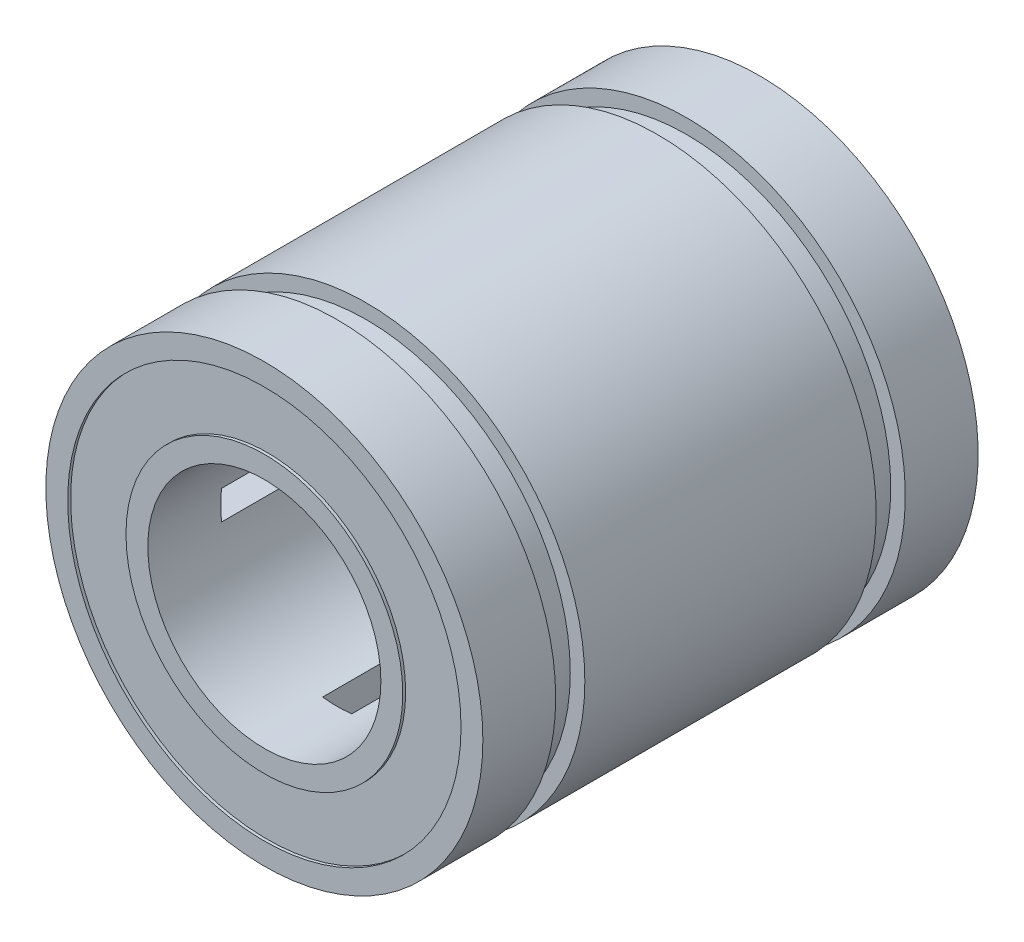
ISO-10303-21;
HEADER;
FILE_DESCRIPTION(('STEP AP214'),'2;1');
FILE_NAME('part.step','',(''),(''),'','','');
FILE_SCHEMA(('AUTOMOTIVE_DESIGN { 1 0 10303 214 1 1 1 1 }'));
ENDSEC;
DATA;
#1=APPLICATION_CONTEXT('core data for automotive mechanical design processes');
#2=APPLICATION_PROTOCOL_DEFINITION('international standard','automotive_design',2000,#1);
#3=PRODUCT_CONTEXT('',#1,'mechanical');
#4=PRODUCT('Part','Part','',(#3));
#5=PRODUCT_RELATED_PRODUCT_CATEGORY('part','',(#4));
#6=PRODUCT_DEFINITION_FORMATION('','',#4);
#7=PRODUCT_DEFINITION_CONTEXT('part definition',#1,'design');
#8=PRODUCT_DEFINITION('design','',#6,#7);
#9=PRODUCT_DEFINITION_SHAPE('','',#8);
#10=(LENGTH_UNIT() NAMED_UNIT(*) SI_UNIT(.MILLI.,.METRE.));
#11=(NAMED_UNIT(*) PLANE_ANGLE_UNIT() SI_UNIT($,.RADIAN.));
#12=(NAMED_UNIT(*) SI_UNIT($,.STERADIAN.) SOLID_ANGLE_UNIT());
#13=UNCERTAINTY_MEASURE_WITH_UNIT(LENGTH_MEASURE(1.E-05),#10,'distance_accuracy_value','');
#14=(GEOMETRIC_REPRESENTATION_CONTEXT(3) GLOBAL_UNCERTAINTY_ASSIGNED_CONTEXT((#13)) GLOBAL_UNIT_ASSIGNED_CONTEXT((#10,
#11,#12)) REPRESENTATION_CONTEXT('',''));
#15=CARTESIAN_POINT('',(0.,0.,0.));
#16=DIRECTION('',(0.,0.,1.));
#17=DIRECTION('',(1.,0.,0.));
#18=AXIS2_PLACEMENT_3D('',#15,#16,#17);
#19=CARTESIAN_POINT('',(0.,0.,-3.5));
#20=DIRECTION('',(0.,0.,-1.));
#21=DIRECTION('',(-1.,0.,0.));
#22=AXIS2_PLACEMENT_3D('',#19,#20,#21);
#23=PLANE('',#22);
#24=CARTESIAN_POINT('',(0.,0.,-3.5));
#25=DIRECTION('',(0.,0.,1.));
#26=DIRECTION('',(1.,0.,0.));
#27=AXIS2_PLACEMENT_3D('',#24,#25,#26);
#28=CIRCLE('',#27,4.);
#29=CARTESIAN_POINT('',(4.,0.,-3.5));
#30=VERTEX_POINT('',#29);
#31=EDGE_CURVE('E289',#30,#30,#28,.T.);
#32=ORIENTED_EDGE('',*,*,#31,.T.);
#33=EDGE_LOOP('',(#32));
#34=FACE_BOUND('',#33,.T.);
#35=CARTESIAN_POINT('',(0.,0.,-3.5));
#36=DIRECTION('',(0.,0.,-1.));
#37=DIRECTION('',(-1.,0.,0.));
#38=AXIS2_PLACEMENT_3D('',#35,#36,#37);
#39=CIRCLE('',#38,4.75);
#40=CARTESIAN_POINT('',(-4.75,0.,-3.5));
#41=VERTEX_POINT('',#40);
#42=EDGE_CURVE('E316',#41,#41,#39,.T.);
#43=ORIENTED_EDGE('',*,*,#42,.T.);
#44=EDGE_LOOP('',(#43));
#45=FACE_BOUND('',#44,.T.);
#46=ADVANCED_FACE('F37',(#34,#45),#23,.T.);
#47=CARTESIAN_POINT('',(0.,0.,13.5));
#48=DIRECTION('',(0.,0.,1.));
#49=DIRECTION('',(1.,0.,0.));
#50=AXIS2_PLACEMENT_3D('',#47,#48,#49);
#51=PLANE('',#50);
#52=CARTESIAN_POINT('',(0.,0.,13.5));
#53=DIRECTION('',(0.,0.,1.));
#54=DIRECTION('',(1.,0.,0.));
#55=AXIS2_PLACEMENT_3D('',#52,#53,#54);
#56=CIRCLE('',#55,4.);
#57=CARTESIAN_POINT('',(4.,0.,13.5));
#58=VERTEX_POINT('',#57);
#59=EDGE_CURVE('E292',#58,#58,#56,.T.);
#60=ORIENTED_EDGE('',*,*,#59,.F.);
#61=EDGE_LOOP('',(#60));
#62=FACE_BOUND('',#61,.T.);
#63=CARTESIAN_POINT('',(0.,0.,13.5));
#64=DIRECTION('',(0.,0.,1.));
#65=DIRECTION('',(1.,0.,0.));
#66=AXIS2_PLACEMENT_3D('',#63,#64,#65);
#67=CIRCLE('',#66,4.75);
#68=CARTESIAN_POINT('',(4.75,0.,13.5));
#69=VERTEX_POINT('',#68);
#70=EDGE_CURVE('E304',#69,#69,#67,.T.);
#71=ORIENTED_EDGE('',*,*,#70,.T.);
#72=EDGE_LOOP('',(#71));
#73=FACE_BOUND('',#72,.T.);
#74=ADVANCED_FACE('F364',(#62,#73),#51,.T.);
#75=CARTESIAN_POINT('',(0.,0.,11.));
#76=DIRECTION('',(0.,0.,1.));
#77=DIRECTION('',(1.,0.,0.));
#78=AXIS2_PLACEMENT_3D('',#75,#76,#77);
#79=PLANE('',#78);
#80=DIRECTION('',(0.,1.,0.));
#81=VECTOR('',#80,1.);
#82=CARTESIAN_POINT('',(0.499999999999999,6.,11.));
#83=LINE('',#82,#81);
#84=CARTESIAN_POINT('',(0.5,3.96862696659689,11.));
#85=VERTEX_POINT('',#84);
#86=CARTESIAN_POINT('',(0.499999999999999,6.,11.));
#87=VERTEX_POINT('',#86);
#88=EDGE_CURVE('E159',#85,#87,#83,.T.);
#89=ORIENTED_EDGE('',*,*,#88,.F.);
#90=CARTESIAN_POINT('',(0.,0.,11.));
#91=DIRECTION('',(0.,0.,1.));
#92=DIRECTION('',(1.,0.,0.));
#93=AXIS2_PLACEMENT_3D('',#90,#91,#92);
#94=CIRCLE('',#93,4.);
#95=CARTESIAN_POINT('',(-0.500000000000001,3.96862696659689,11.));
#96=VERTEX_POINT('',#95);
#97=EDGE_CURVE('E11',#85,#96,#94,.T.);
#98=ORIENTED_EDGE('',*,*,#97,.T.);
#99=DIRECTION('',(0.,-1.,0.));
#100=VECTOR('',#99,1.);
#101=CARTESIAN_POINT('',(-0.500000000000001,6.,11.));
#102=LINE('',#101,#100);
#103=CARTESIAN_POINT('',(-0.500000000000001,6.,11.));
#104=VERTEX_POINT('',#103);
#105=EDGE_CURVE('E228',#104,#96,#102,.T.);
#106=ORIENTED_EDGE('',*,*,#105,.F.);
#107=DIRECTION('',(-1.,0.,0.));
#108=VECTOR('',#107,1.);
#109=CARTESIAN_POINT('',(-0.500000000000001,6.,11.));
#110=LINE('',#109,#108);
#111=EDGE_CURVE('E232',#87,#104,#110,.T.);
#112=ORIENTED_EDGE('',*,*,#111,.F.);
#113=EDGE_LOOP('',(#89,#98,#106,#112));
#114=FACE_BOUND('',#113,.T.);
#115=ADVANCED_FACE('F362',(#114),#79,.F.);
#116=DIRECTION('',(-1.,0.,0.));
#117=VECTOR('',#116,1.);
#118=CARTESIAN_POINT('',(0.,0.5,11.));
#119=LINE('',#118,#117);
#120=CARTESIAN_POINT('',(-3.96862696659689,0.5,11.));
#121=VERTEX_POINT('',#120);
#122=CARTESIAN_POINT('',(-6.,0.5,11.));
#123=VERTEX_POINT('',#122);
#124=EDGE_CURVE('E170',#121,#123,#119,.T.);
#125=ORIENTED_EDGE('',*,*,#124,.F.);
#126=CARTESIAN_POINT('',(-3.96862696659689,-0.5,11.));
#127=VERTEX_POINT('',#126);
#128=EDGE_CURVE('E46',#121,#127,#94,.T.);
#129=ORIENTED_EDGE('',*,*,#128,.T.);
#130=DIRECTION('',(1.,0.,0.));
#131=VECTOR('',#130,1.);
#132=CARTESIAN_POINT('',(-6.,-0.5,11.));
#133=LINE('',#132,#131);
#134=CARTESIAN_POINT('',(-6.,-0.5,11.));
#135=VERTEX_POINT('',#134);
#136=EDGE_CURVE('E265',#135,#127,#133,.T.);
#137=ORIENTED_EDGE('',*,*,#136,.F.);
#138=DIRECTION('',(0.,-1.,0.));
#139=VECTOR('',#138,1.);
#140=CARTESIAN_POINT('',(-6.,0.5,11.));
#141=LINE('',#140,#139);
#142=EDGE_CURVE('E269',#123,#135,#141,.T.);
#143=ORIENTED_EDGE('',*,*,#142,.F.);
#144=EDGE_LOOP('',(#125,#129,#137,#143));
#145=FACE_BOUND('',#144,.T.);
#146=ADVANCED_FACE('F628',(#145),#79,.F.);
#147=CARTESIAN_POINT('',(-0.499999999999999,-3.96862696659689,11.));
#148=VERTEX_POINT('',#147);
#149=CARTESIAN_POINT('',(-0.499999999999999,-6.,11.));
#150=VERTEX_POINT('',#149);
#151=EDGE_CURVE('E231',#148,#150,#102,.T.);
#152=ORIENTED_EDGE('',*,*,#151,.F.);
#153=CARTESIAN_POINT('',(0.5,-3.96862696659689,11.));
#154=VERTEX_POINT('',#153);
#155=EDGE_CURVE('E164',#148,#154,#94,.T.);
#156=ORIENTED_EDGE('',*,*,#155,.T.);
#157=CARTESIAN_POINT('',(0.500000000000001,-6.,11.));
#158=VERTEX_POINT('',#157);
#159=EDGE_CURVE('E235',#158,#154,#83,.T.);
#160=ORIENTED_EDGE('',*,*,#159,.F.);
#161=DIRECTION('',(1.,0.,0.));
#162=VECTOR('',#161,1.);
#163=CARTESIAN_POINT('',(-0.499999999999999,-6.,11.));
#164=LINE('',#163,#162);
#165=EDGE_CURVE('E224',#150,#158,#164,.T.);
#166=ORIENTED_EDGE('',*,*,#165,.F.);
#167=EDGE_LOOP('',(#152,#156,#160,#166));
#168=FACE_BOUND('',#167,.T.);
#169=ADVANCED_FACE('F400',(#168),#79,.F.);
#170=CARTESIAN_POINT('',(0.,0.,0.999999999999999));
#171=DIRECTION('',(0.,0.,1.));
#172=DIRECTION('',(1.,0.,0.));
#173=AXIS2_PLACEMENT_3D('',#170,#171,#172);
#174=PLANE('',#173);
#175=DIRECTION('',(0.,-1.,0.));
#176=VECTOR('',#175,1.);
#177=CARTESIAN_POINT('',(-0.500000000000001,6.,0.999999999999999));
#178=LINE('',#177,#176);
#179=CARTESIAN_POINT('',(-0.499999999999999,-3.96862696659689,0.999999999999999));
#180=VERTEX_POINT('',#179);
#181=CARTESIAN_POINT('',(-0.499999999999999,-6.,0.999999999999999));
#182=VERTEX_POINT('',#181);
#183=EDGE_CURVE('E243',#180,#182,#178,.T.);
#184=ORIENTED_EDGE('',*,*,#183,.T.);
#185=DIRECTION('',(1.,0.,0.));
#186=VECTOR('',#185,1.);
#187=CARTESIAN_POINT('',(-0.499999999999999,-6.,0.999999999999999));
#188=LINE('',#187,#186);
#189=CARTESIAN_POINT('',(0.500000000000001,-6.,0.999999999999999));
#190=VERTEX_POINT('',#189);
#191=EDGE_CURVE('E216',#182,#190,#188,.T.);
#192=ORIENTED_EDGE('',*,*,#191,.T.);
#193=DIRECTION('',(0.,1.,0.));
#194=VECTOR('',#193,1.);
#195=CARTESIAN_POINT('',(0.499999999999999,6.,0.999999999999999));
#196=LINE('',#195,#194);
#197=CARTESIAN_POINT('',(0.5,-3.96862696659689,0.999999999999999));
#198=VERTEX_POINT('',#197);
#199=EDGE_CURVE('E247',#190,#198,#196,.T.);
#200=ORIENTED_EDGE('',*,*,#199,.T.);
#201=CARTESIAN_POINT('',(0.,0.,0.999999999999999));
#202=DIRECTION('',(0.,0.,1.));
#203=DIRECTION('',(1.,0.,0.));
#204=AXIS2_PLACEMENT_3D('',#201,#202,#203);
#205=CIRCLE('',#204,4.);
#206=EDGE_CURVE('E184',#180,#198,#205,.T.);
#207=ORIENTED_EDGE('',*,*,#206,.F.);
#208=EDGE_LOOP('',(#184,#192,#200,#207));
#209=FACE_BOUND('',#208,.T.);
#210=ADVANCED_FACE('F396',(#209),#174,.T.);
#211=CARTESIAN_POINT('',(0.5,3.96862696659689,0.999999999999999));
#212=VERTEX_POINT('',#211);
#213=CARTESIAN_POINT('',(0.499999999999999,6.,0.999999999999999));
#214=VERTEX_POINT('',#213);
#215=EDGE_CURVE('E227',#212,#214,#196,.T.);
#216=ORIENTED_EDGE('',*,*,#215,.T.);
#217=DIRECTION('',(-1.,0.,0.));
#218=VECTOR('',#217,1.);
#219=CARTESIAN_POINT('',(-0.500000000000001,6.,0.999999999999999));
#220=LINE('',#219,#218);
#221=CARTESIAN_POINT('',(-0.500000000000001,6.,0.999999999999999));
#222=VERTEX_POINT('',#221);
#223=EDGE_CURVE('E244',#214,#222,#220,.T.);
#224=ORIENTED_EDGE('',*,*,#223,.T.);
#225=CARTESIAN_POINT('',(-0.500000000000001,3.96862696659689,0.999999999999999));
#226=VERTEX_POINT('',#225);
#227=EDGE_CURVE('E240',#222,#226,#178,.T.);
#228=ORIENTED_EDGE('',*,*,#227,.T.);
#229=EDGE_CURVE('E178',#212,#226,#205,.T.);
#230=ORIENTED_EDGE('',*,*,#229,.F.);
#231=EDGE_LOOP('',(#216,#224,#228,#230));
#232=FACE_BOUND('',#231,.T.);
#233=ADVANCED_FACE('F399',(#232),#174,.T.);
#234=CARTESIAN_POINT('',(0.,0.,0.999999999999999));
#235=DIRECTION('',(0.,0.,1.));
#236=DIRECTION('',(1.,0.,0.));
#237=AXIS2_PLACEMENT_3D('',#234,#235,#236);
#238=PLANE('',#237);
#239=DIRECTION('',(-1.,0.,0.));
#240=VECTOR('',#239,1.);
#241=CARTESIAN_POINT('',(-6.,0.5,0.999999999999999));
#242=LINE('',#241,#240);
#243=CARTESIAN_POINT('',(-3.96862696659689,0.5,0.999999999999999));
#244=VERTEX_POINT('',#243);
#245=CARTESIAN_POINT('',(-6.,0.5,0.999999999999999));
#246=VERTEX_POINT('',#245);
#247=EDGE_CURVE('E283',#244,#246,#242,.T.);
#248=ORIENTED_EDGE('',*,*,#247,.T.);
#249=DIRECTION('',(0.,-1.,0.));
#250=VECTOR('',#249,1.);
#251=CARTESIAN_POINT('',(-6.,0.5,0.999999999999999));
#252=LINE('',#251,#250);
#253=CARTESIAN_POINT('',(-6.,-0.5,0.999999999999999));
#254=VERTEX_POINT('',#253);
#255=EDGE_CURVE('E277',#246,#254,#252,.T.);
#256=ORIENTED_EDGE('',*,*,#255,.T.);
#257=DIRECTION('',(1.,0.,0.));
#258=VECTOR('',#257,1.);
#259=CARTESIAN_POINT('',(-6.,-0.5,0.999999999999999));
#260=LINE('',#259,#258);
#261=CARTESIAN_POINT('',(-3.96862696659689,-0.5,0.999999999999999));
#262=VERTEX_POINT('',#261);
#263=EDGE_CURVE('E258',#254,#262,#260,.T.);
#264=ORIENTED_EDGE('',*,*,#263,.T.);
#265=CARTESIAN_POINT('',(0.,0.,0.999999999999999));
#266=DIRECTION('',(0.,0.,1.));
#267=DIRECTION('',(1.,0.,0.));
#268=AXIS2_PLACEMENT_3D('',#265,#266,#267);
#269=CIRCLE('',#268,4.);
#270=EDGE_CURVE('E165',#244,#262,#269,.T.);
#271=ORIENTED_EDGE('',*,*,#270,.F.);
#272=EDGE_LOOP('',(#248,#256,#264,#271));
#273=FACE_BOUND('',#272,.T.);
#274=ADVANCED_FACE('F419',(#273),#238,.T.);
#275=CARTESIAN_POINT('',(0.,0.,10.));
#276=DIRECTION('',(0.,0.,-1.));
#277=DIRECTION('',(-1.,0.,0.));
#278=AXIS2_PLACEMENT_3D('',#275,#276,#277);
#279=CYLINDRICAL_SURFACE('',#278,4.);
#280=ORIENTED_EDGE('',*,*,#128,.F.);
#281=DIRECTION('',(0.,0.,-1.));
#282=VECTOR('',#281,1.);
#283=CARTESIAN_POINT('',(-3.96862696659689,0.5,10.));
#284=LINE('',#283,#282);
#285=EDGE_CURVE('E251',#244,#121,#284,.F.);
#286=ORIENTED_EDGE('',*,*,#285,.F.);
#287=ORIENTED_EDGE('',*,*,#270,.T.);
#288=DIRECTION('',(0.,0.,-1.));
#289=VECTOR('',#288,1.);
#290=CARTESIAN_POINT('',(-3.96862696659689,-0.5,10.));
#291=LINE('',#290,#289);
#292=EDGE_CURVE('E160',#127,#262,#291,.T.);
#293=ORIENTED_EDGE('',*,*,#292,.F.);
#294=EDGE_LOOP('',(#280,#286,#287,#293));
#295=FACE_BOUND('',#294,.T.);
#296=ORIENTED_EDGE('',*,*,#155,.F.);
#297=DIRECTION('',(0.,0.,-1.));
#298=VECTOR('',#297,1.);
#299=CARTESIAN_POINT('',(-0.499999999999999,-3.96862696659689,10.));
#300=LINE('',#299,#298);
#301=EDGE_CURVE('E182',#180,#148,#300,.F.);
#302=ORIENTED_EDGE('',*,*,#301,.F.);
#303=ORIENTED_EDGE('',*,*,#206,.T.);
#304=DIRECTION('',(0.,0.,-1.));
#305=VECTOR('',#304,1.);
#306=CARTESIAN_POINT('',(0.5,-3.96862696659689,10.));
#307=LINE('',#306,#305);
#308=EDGE_CURVE('E179',#154,#198,#307,.T.);
#309=ORIENTED_EDGE('',*,*,#308,.F.);
#310=EDGE_LOOP('',(#296,#302,#303,#309));
#311=FACE_BOUND('',#310,.T.);
#312=CARTESIAN_POINT('',(3.96862696659689,-0.5,11.));
#313=VERTEX_POINT('',#312);
#314=CARTESIAN_POINT('',(3.96862696659689,0.5,11.));
#315=VERTEX_POINT('',#314);
#316=EDGE_CURVE('E41',#313,#315,#94,.T.);
#317=ORIENTED_EDGE('',*,*,#316,.F.);
#318=DIRECTION('',(0.,0.,-1.));
#319=VECTOR('',#318,1.);
#320=CARTESIAN_POINT('',(3.96862696659689,-0.5,10.));
#321=LINE('',#320,#319);
#322=CARTESIAN_POINT('',(3.96862696659689,-0.5,0.999999999999999));
#323=VERTEX_POINT('',#322);
#324=EDGE_CURVE('E153',#323,#313,#321,.F.);
#325=ORIENTED_EDGE('',*,*,#324,.F.);
#326=CARTESIAN_POINT('',(3.96862696659689,0.5,0.999999999999999));
#327=VERTEX_POINT('',#326);
#328=EDGE_CURVE('E169',#323,#327,#269,.T.);
#329=ORIENTED_EDGE('',*,*,#328,.T.);
#330=DIRECTION('',(0.,0.,-1.));
#331=VECTOR('',#330,1.);
#332=CARTESIAN_POINT('',(3.96862696659689,0.5,10.));
#333=LINE('',#332,#331);
#334=EDGE_CURVE('E53',#315,#327,#333,.T.);
#335=ORIENTED_EDGE('',*,*,#334,.F.);
#336=EDGE_LOOP('',(#317,#325,#329,#335));
#337=FACE_BOUND('',#336,.T.);
#338=DIRECTION('',(0.,0.,-1.));
#339=VECTOR('',#338,1.);
#340=CARTESIAN_POINT('',(-0.500000000000001,3.96862696659689,10.));
#341=LINE('',#340,#339);
#342=EDGE_CURVE('E176',#96,#226,#341,.T.);
#343=ORIENTED_EDGE('',*,*,#342,.F.);
#344=ORIENTED_EDGE('',*,*,#97,.F.);
#345=DIRECTION('',(0.,0.,-1.));
#346=VECTOR('',#345,1.);
#347=CARTESIAN_POINT('',(0.5,3.96862696659689,10.));
#348=LINE('',#347,#346);
#349=EDGE_CURVE('E172',#212,#85,#348,.F.);
#350=ORIENTED_EDGE('',*,*,#349,.F.);
#351=ORIENTED_EDGE('',*,*,#229,.T.);
#352=EDGE_LOOP('',(#343,#344,#350,#351));
#353=FACE_BOUND('',#352,.T.);
#354=ORIENTED_EDGE('',*,*,#59,.T.);
#355=EDGE_LOOP('',(#354));
#356=FACE_BOUND('',#355,.T.);
#357=ORIENTED_EDGE('',*,*,#31,.F.);
#358=EDGE_LOOP('',(#357));
#359=FACE_BOUND('',#358,.T.);
#360=ADVANCED_FACE('F162',(#295,#311,#337,#353,#356,#359),#279,.F.);
#361=CARTESIAN_POINT('',(6.,-0.5,0.999999999999999));
#362=VERTEX_POINT('',#361);
#363=EDGE_CURVE('E158',#323,#362,#260,.T.);
#364=ORIENTED_EDGE('',*,*,#363,.T.);
#365=DIRECTION('',(0.,1.,0.));
#366=VECTOR('',#365,1.);
#367=CARTESIAN_POINT('',(6.,0.5,0.999999999999999));
#368=LINE('',#367,#366);
#369=CARTESIAN_POINT('',(6.,0.5,0.999999999999999));
#370=VERTEX_POINT('',#369);
#371=EDGE_CURVE('E268',#362,#370,#368,.T.);
#372=ORIENTED_EDGE('',*,*,#371,.T.);
#373=EDGE_CURVE('E280',#370,#327,#242,.T.);
#374=ORIENTED_EDGE('',*,*,#373,.T.);
#375=ORIENTED_EDGE('',*,*,#328,.F.);
#376=EDGE_LOOP('',(#364,#372,#374,#375));
#377=FACE_BOUND('',#376,.T.);
#378=ADVANCED_FACE('F394',(#377),#238,.T.);
#379=CARTESIAN_POINT('',(-0.499999999999999,-6.,0.999999999999999));
#380=DIRECTION('',(0.,-1.,0.));
#381=DIRECTION('',(0.,0.,-1.));
#382=AXIS2_PLACEMENT_3D('',#379,#380,#381);
#383=PLANE('',#382);
#384=ORIENTED_EDGE('',*,*,#165,.T.);
#385=DIRECTION('',(0.,0.,1.));
#386=VECTOR('',#385,1.);
#387=CARTESIAN_POINT('',(0.500000000000001,-6.,0.999999999999999));
#388=LINE('',#387,#386);
#389=EDGE_CURVE('E209',#190,#158,#388,.T.);
#390=ORIENTED_EDGE('',*,*,#389,.F.);
#391=ORIENTED_EDGE('',*,*,#191,.F.);
#392=DIRECTION('',(0.,0.,1.));
#393=VECTOR('',#392,1.);
#394=CARTESIAN_POINT('',(-0.499999999999999,-6.,0.999999999999999));
#395=LINE('',#394,#393);
#396=EDGE_CURVE('E219',#182,#150,#395,.T.);
#397=ORIENTED_EDGE('',*,*,#396,.T.);
#398=EDGE_LOOP('',(#384,#390,#391,#397));
#399=FACE_BOUND('',#398,.T.);
#400=ADVANCED_FACE('F384',(#399),#383,.F.);
#401=CARTESIAN_POINT('',(-0.500000000000001,6.,0.999999999999999));
#402=DIRECTION('',(0.,1.,0.));
#403=DIRECTION('',(0.,0.,1.));
#404=AXIS2_PLACEMENT_3D('',#401,#402,#403);
#405=PLANE('',#404);
#406=ORIENTED_EDGE('',*,*,#111,.T.);
#407=DIRECTION('',(0.,0.,1.));
#408=VECTOR('',#407,1.);
#409=CARTESIAN_POINT('',(-0.500000000000001,6.,0.999999999999999));
#410=LINE('',#409,#408);
#411=EDGE_CURVE('E215',#222,#104,#410,.T.);
#412=ORIENTED_EDGE('',*,*,#411,.F.);
#413=ORIENTED_EDGE('',*,*,#223,.F.);
#414=DIRECTION('',(0.,0.,1.));
#415=VECTOR('',#414,1.);
#416=CARTESIAN_POINT('',(0.499999999999999,6.,0.999999999999999));
#417=LINE('',#416,#415);
#418=EDGE_CURVE('E212',#214,#87,#417,.T.);
#419=ORIENTED_EDGE('',*,*,#418,.T.);
#420=EDGE_LOOP('',(#406,#412,#413,#419));
#421=FACE_BOUND('',#420,.T.);
#422=ADVANCED_FACE('F380',(#421),#405,.F.);
#423=CARTESIAN_POINT('',(-6.,-0.5,0.999999999999999));
#424=DIRECTION('',(0.,-1.,0.));
#425=DIRECTION('',(0.,0.,-1.));
#426=AXIS2_PLACEMENT_3D('',#423,#424,#425);
#427=PLANE('',#426);
#428=ORIENTED_EDGE('',*,*,#136,.T.);
#429=ORIENTED_EDGE('',*,*,#292,.T.);
#430=ORIENTED_EDGE('',*,*,#263,.F.);
#431=DIRECTION('',(0.,0.,1.));
#432=VECTOR('',#431,1.);
#433=CARTESIAN_POINT('',(-6.,-0.5,0.999999999999999));
#434=LINE('',#433,#432);
#435=EDGE_CURVE('E261',#254,#135,#434,.T.);
#436=ORIENTED_EDGE('',*,*,#435,.T.);
#437=EDGE_LOOP('',(#428,#429,#430,#436));
#438=FACE_BOUND('',#437,.T.);
#439=ADVANCED_FACE('F383',(#438),#427,.F.);
#440=CARTESIAN_POINT('',(-6.,0.5,0.999999999999999));
#441=DIRECTION('',(-1.,0.,0.));
#442=DIRECTION('',(0.,0.,1.));
#443=AXIS2_PLACEMENT_3D('',#440,#441,#442);
#444=PLANE('',#443);
#445=ORIENTED_EDGE('',*,*,#142,.T.);
#446=ORIENTED_EDGE('',*,*,#435,.F.);
#447=ORIENTED_EDGE('',*,*,#255,.F.);
#448=DIRECTION('',(0.,0.,1.));
#449=VECTOR('',#448,1.);
#450=CARTESIAN_POINT('',(-6.,0.5,0.999999999999999));
#451=LINE('',#450,#449);
#452=EDGE_CURVE('E257',#246,#123,#451,.T.);
#453=ORIENTED_EDGE('',*,*,#452,.T.);
#454=EDGE_LOOP('',(#445,#446,#447,#453));
#455=FACE_BOUND('',#454,.T.);
#456=ADVANCED_FACE('F408',(#455),#444,.F.);
#457=CARTESIAN_POINT('',(-6.,0.5,0.999999999999999));
#458=DIRECTION('',(0.,1.,0.));
#459=DIRECTION('',(0.,0.,1.));
#460=AXIS2_PLACEMENT_3D('',#457,#458,#459);
#461=PLANE('',#460);
#462=ORIENTED_EDGE('',*,*,#285,.T.);
#463=ORIENTED_EDGE('',*,*,#124,.T.);
#464=ORIENTED_EDGE('',*,*,#452,.F.);
#465=ORIENTED_EDGE('',*,*,#247,.F.);
#466=EDGE_LOOP('',(#462,#463,#464,#465));
#467=FACE_BOUND('',#466,.T.);
#468=ADVANCED_FACE('F390',(#467),#461,.F.);
#469=CARTESIAN_POINT('',(-0.500000000000001,6.,0.999999999999999));
#470=DIRECTION('',(-1.,0.,0.));
#471=DIRECTION('',(0.,-1.,0.));
#472=AXIS2_PLACEMENT_3D('',#469,#470,#471);
#473=PLANE('',#472);
#474=ORIENTED_EDGE('',*,*,#105,.T.);
#475=ORIENTED_EDGE('',*,*,#342,.T.);
#476=ORIENTED_EDGE('',*,*,#227,.F.);
#477=ORIENTED_EDGE('',*,*,#411,.T.);
#478=EDGE_LOOP('',(#474,#475,#476,#477));
#479=FACE_BOUND('',#478,.T.);
#480=ADVANCED_FACE('F386',(#479),#473,.F.);
#481=CARTESIAN_POINT('',(6.,0.5,0.999999999999999));
#482=DIRECTION('',(1.,0.,0.));
#483=DIRECTION('',(0.,0.,-1.));
#484=AXIS2_PLACEMENT_3D('',#481,#482,#483);
#485=PLANE('',#484);
#486=DIRECTION('',(0.,1.,0.));
#487=VECTOR('',#486,1.);
#488=CARTESIAN_POINT('',(6.,0.5,11.));
#489=LINE('',#488,#487);
#490=CARTESIAN_POINT('',(6.,-0.5,11.));
#491=VERTEX_POINT('',#490);
#492=CARTESIAN_POINT('',(6.,0.5,11.));
#493=VERTEX_POINT('',#492);
#494=EDGE_CURVE('E167',#491,#493,#489,.T.);
#495=ORIENTED_EDGE('',*,*,#494,.T.);
#496=DIRECTION('',(0.,0.,1.));
#497=VECTOR('',#496,1.);
#498=CARTESIAN_POINT('',(6.,0.5,0.999999999999999));
#499=LINE('',#498,#497);
#500=EDGE_CURVE('E254',#370,#493,#499,.T.);
#501=ORIENTED_EDGE('',*,*,#500,.F.);
#502=ORIENTED_EDGE('',*,*,#371,.F.);
#503=DIRECTION('',(0.,0.,1.));
#504=VECTOR('',#503,1.);
#505=CARTESIAN_POINT('',(6.,-0.5,0.999999999999999));
#506=LINE('',#505,#504);
#507=EDGE_CURVE('E253',#362,#491,#506,.T.);
#508=ORIENTED_EDGE('',*,*,#507,.T.);
#509=EDGE_LOOP('',(#495,#501,#502,#508));
#510=FACE_BOUND('',#509,.T.);
#511=ADVANCED_FACE('F389',(#510),#485,.F.);
#512=DIRECTION('',(-1.,0.,0.));
#513=VECTOR('',#512,1.);
#514=CARTESIAN_POINT('',(-6.,0.5,11.));
#515=LINE('',#514,#513);
#516=EDGE_CURVE('E60',#493,#315,#515,.T.);
#517=ORIENTED_EDGE('',*,*,#516,.T.);
#518=ORIENTED_EDGE('',*,*,#334,.T.);
#519=ORIENTED_EDGE('',*,*,#373,.F.);
#520=ORIENTED_EDGE('',*,*,#500,.T.);
#521=EDGE_LOOP('',(#517,#518,#519,#520));
#522=FACE_BOUND('',#521,.T.);
#523=ADVANCED_FACE('F404',(#522),#461,.F.);
#524=ORIENTED_EDGE('',*,*,#324,.T.);
#525=DIRECTION('',(1.,0.,0.));
#526=VECTOR('',#525,1.);
#527=CARTESIAN_POINT('',(0.,-0.5,11.));
#528=LINE('',#527,#526);
#529=EDGE_CURVE('E157',#313,#491,#528,.T.);
#530=ORIENTED_EDGE('',*,*,#529,.T.);
#531=ORIENTED_EDGE('',*,*,#507,.F.);
#532=ORIENTED_EDGE('',*,*,#363,.F.);
#533=EDGE_LOOP('',(#524,#530,#531,#532));
#534=FACE_BOUND('',#533,.T.);
#535=ADVANCED_FACE('F154',(#534),#427,.F.);
#536=CARTESIAN_POINT('',(0.499999999999999,6.,0.999999999999999));
#537=DIRECTION('',(1.,0.,0.));
#538=DIRECTION('',(0.,1.,0.));
#539=AXIS2_PLACEMENT_3D('',#536,#537,#538);
#540=PLANE('',#539);
#541=ORIENTED_EDGE('',*,*,#349,.T.);
#542=ORIENTED_EDGE('',*,*,#88,.T.);
#543=ORIENTED_EDGE('',*,*,#418,.F.);
#544=ORIENTED_EDGE('',*,*,#215,.F.);
#545=EDGE_LOOP('',(#541,#542,#543,#544));
#546=FACE_BOUND('',#545,.T.);
#547=ADVANCED_FACE('F374',(#546),#540,.F.);
#548=ORIENTED_EDGE('',*,*,#301,.T.);
#549=ORIENTED_EDGE('',*,*,#151,.T.);
#550=ORIENTED_EDGE('',*,*,#396,.F.);
#551=ORIENTED_EDGE('',*,*,#183,.F.);
#552=EDGE_LOOP('',(#548,#549,#550,#551));
#553=FACE_BOUND('',#552,.T.);
#554=ADVANCED_FACE('F377',(#553),#473,.F.);
#555=ORIENTED_EDGE('',*,*,#159,.T.);
#556=ORIENTED_EDGE('',*,*,#308,.T.);
#557=ORIENTED_EDGE('',*,*,#199,.F.);
#558=ORIENTED_EDGE('',*,*,#389,.T.);
#559=EDGE_LOOP('',(#555,#556,#557,#558));
#560=FACE_BOUND('',#559,.T.);
#561=ADVANCED_FACE('F379',(#560),#540,.F.);
#562=ORIENTED_EDGE('',*,*,#529,.F.);
#563=ORIENTED_EDGE('',*,*,#316,.T.);
#564=ORIENTED_EDGE('',*,*,#516,.F.);
#565=ORIENTED_EDGE('',*,*,#494,.F.);
#566=EDGE_LOOP('',(#562,#563,#564,#565));
#567=FACE_BOUND('',#566,.T.);
#568=ADVANCED_FACE('F166',(#567),#79,.F.);
#569=CARTESIAN_POINT('',(0.,0.,10.));
#570=DIRECTION('',(0.,0.,1.));
#571=DIRECTION('',(1.,0.,0.));
#572=AXIS2_PLACEMENT_3D('',#569,#570,#571);
#573=PLANE('',#572);
#574=CARTESIAN_POINT('',(0.,0.,10.));
#575=DIRECTION('',(0.,0.,1.));
#576=DIRECTION('',(1.,0.,0.));
#577=AXIS2_PLACEMENT_3D('',#574,#575,#576);
#578=CIRCLE('',#577,7.);
#579=CARTESIAN_POINT('',(7.,0.,10.));
#580=VERTEX_POINT('',#579);
#581=EDGE_CURVE('E197',#580,#580,#578,.T.);
#582=ORIENTED_EDGE('',*,*,#581,.F.);
#583=EDGE_LOOP('',(#582));
#584=FACE_BOUND('',#583,.T.);
#585=CARTESIAN_POINT('',(0.,0.,10.));
#586=DIRECTION('',(0.,0.,1.));
#587=DIRECTION('',(1.,0.,0.));
#588=AXIS2_PLACEMENT_3D('',#585,#586,#587);
#589=CIRCLE('',#588,7.5);
#590=CARTESIAN_POINT('',(7.5,0.,10.));
#591=VERTEX_POINT('',#590);
#592=EDGE_CURVE('E190',#591,#591,#589,.T.);
#593=ORIENTED_EDGE('',*,*,#592,.T.);
#594=EDGE_LOOP('',(#593));
#595=FACE_BOUND('',#594,.T.);
#596=ADVANCED_FACE('F544',(#584,#595),#573,.T.);
#597=CARTESIAN_POINT('',(0.,0.,0.));
#598=DIRECTION('',(0.,0.,1.));
#599=DIRECTION('',(1.,0.,0.));
#600=AXIS2_PLACEMENT_3D('',#597,#598,#599);
#601=PLANE('',#600);
#602=CARTESIAN_POINT('',(0.,0.,0.));
#603=DIRECTION('',(0.,0.,1.));
#604=DIRECTION('',(1.,0.,0.));
#605=AXIS2_PLACEMENT_3D('',#602,#603,#604);
#606=CIRCLE('',#605,7.);
#607=CARTESIAN_POINT('',(7.,0.,0.));
#608=VERTEX_POINT('',#607);
#609=EDGE_CURVE('E187',#608,#608,#606,.F.);
#610=ORIENTED_EDGE('',*,*,#609,.F.);
#611=EDGE_LOOP('',(#610));
#612=FACE_BOUND('',#611,.T.);
#613=CARTESIAN_POINT('',(0.,0.,0.));
#614=DIRECTION('',(0.,0.,1.));
#615=DIRECTION('',(1.,0.,0.));
#616=AXIS2_PLACEMENT_3D('',#613,#614,#615);
#617=CIRCLE('',#616,7.5);
#618=CARTESIAN_POINT('',(7.5,0.,0.));
#619=VERTEX_POINT('',#618);
#620=EDGE_CURVE('E191',#619,#619,#617,.T.);
#621=ORIENTED_EDGE('',*,*,#620,.F.);
#622=EDGE_LOOP('',(#621));
#623=FACE_BOUND('',#622,.T.);
#624=ADVANCED_FACE('F539',(#612,#623),#601,.F.);
#625=CARTESIAN_POINT('',(0.,0.,10.));
#626=DIRECTION('',(0.,0.,-1.));
#627=DIRECTION('',(-1.,0.,0.));
#628=AXIS2_PLACEMENT_3D('',#625,#626,#627);
#629=CYLINDRICAL_SURFACE('',#628,7.5);
#630=ORIENTED_EDGE('',*,*,#592,.F.);
#631=EDGE_LOOP('',(#630));
#632=FACE_BOUND('',#631,.T.);
#633=ORIENTED_EDGE('',*,*,#620,.T.);
#634=EDGE_LOOP('',(#633));
#635=FACE_BOUND('',#634,.T.);
#636=ADVANCED_FACE('F39',(#632,#635),#629,.T.);
#637=CARTESIAN_POINT('',(0.,0.,11.));
#638=DIRECTION('',(0.,0.,-1.));
#639=DIRECTION('',(-1.,0.,0.));
#640=AXIS2_PLACEMENT_3D('',#637,#638,#639);
#641=CYLINDRICAL_SURFACE('',#640,7.);
#642=CARTESIAN_POINT('',(0.,0.,11.));
#643=DIRECTION('',(0.,0.,1.));
#644=DIRECTION('',(1.,0.,0.));
#645=AXIS2_PLACEMENT_3D('',#642,#643,#644);
#646=CIRCLE('',#645,7.);
#647=CARTESIAN_POINT('',(7.,0.,11.));
#648=VERTEX_POINT('',#647);
#649=EDGE_CURVE('E194',#648,#648,#646,.T.);
#650=ORIENTED_EDGE('',*,*,#649,.F.);
#651=EDGE_LOOP('',(#650));
#652=FACE_BOUND('',#651,.T.);
#653=ORIENTED_EDGE('',*,*,#581,.T.);
#654=EDGE_LOOP('',(#653));
#655=FACE_BOUND('',#654,.T.);
#656=ADVANCED_FACE('F531',(#652,#655),#641,.T.);
#657=CARTESIAN_POINT('',(0.,0.,-1.));
#658=DIRECTION('',(0.,0.,1.));
#659=DIRECTION('',(1.,0.,0.));
#660=AXIS2_PLACEMENT_3D('',#657,#658,#659);
#661=CYLINDRICAL_SURFACE('',#660,7.);
#662=CARTESIAN_POINT('',(0.,0.,-1.));
#663=DIRECTION('',(0.,0.,-1.));
#664=DIRECTION('',(-1.,0.,0.));
#665=AXIS2_PLACEMENT_3D('',#662,#663,#664);
#666=CIRCLE('',#665,7.);
#667=CARTESIAN_POINT('',(-7.,0.,-1.));
#668=VERTEX_POINT('',#667);
#669=EDGE_CURVE('E200',#668,#668,#666,.T.);
#670=ORIENTED_EDGE('',*,*,#669,.F.);
#671=EDGE_LOOP('',(#670));
#672=FACE_BOUND('',#671,.T.);
#673=ORIENTED_EDGE('',*,*,#609,.T.);
#674=EDGE_LOOP('',(#673));
#675=FACE_BOUND('',#674,.T.);
#676=ADVANCED_FACE('F348',(#672,#675),#661,.T.);
#677=CARTESIAN_POINT('',(0.,0.,-3.5));
#678=DIRECTION('',(0.,0.,1.));
#679=DIRECTION('',(1.,0.,0.));
#680=AXIS2_PLACEMENT_3D('',#677,#678,#679);
#681=CYLINDRICAL_SURFACE('',#680,7.5);
#682=CARTESIAN_POINT('',(0.,0.,-3.5));
#683=DIRECTION('',(0.,0.,-1.));
#684=DIRECTION('',(-1.,0.,0.));
#685=AXIS2_PLACEMENT_3D('',#682,#683,#684);
#686=CIRCLE('',#685,7.5);
#687=CARTESIAN_POINT('',(-7.5,0.,-3.5));
#688=VERTEX_POINT('',#687);
#689=EDGE_CURVE('E205',#688,#688,#686,.T.);
#690=ORIENTED_EDGE('',*,*,#689,.F.);
#691=EDGE_LOOP('',(#690));
#692=FACE_BOUND('',#691,.T.);
#693=CARTESIAN_POINT('',(0.,0.,-1.));
#694=DIRECTION('',(0.,0.,-1.));
#695=DIRECTION('',(-1.,0.,0.));
#696=AXIS2_PLACEMENT_3D('',#693,#694,#695);
#697=CIRCLE('',#696,7.5);
#698=CARTESIAN_POINT('',(-7.5,0.,-1.));
#699=VERTEX_POINT('',#698);
#700=EDGE_CURVE('E206',#699,#699,#697,.T.);
#701=ORIENTED_EDGE('',*,*,#700,.T.);
#702=EDGE_LOOP('',(#701));
#703=FACE_BOUND('',#702,.T.);
#704=ADVANCED_FACE('F342',(#692,#703),#681,.T.);
#705=CARTESIAN_POINT('',(0.,0.,-3.5));
#706=DIRECTION('',(0.,0.,-1.));
#707=DIRECTION('',(-1.,0.,0.));
#708=AXIS2_PLACEMENT_3D('',#705,#706,#707);
#709=CIRCLE('',#708,6.75);
#710=CARTESIAN_POINT('',(-6.75,0.,-3.5));
#711=VERTEX_POINT('',#710);
#712=EDGE_CURVE('E310',#711,#711,#709,.T.);
#713=ORIENTED_EDGE('',*,*,#712,.F.);
#714=EDGE_LOOP('',(#713));
#715=FACE_BOUND('',#714,.T.);
#716=ORIENTED_EDGE('',*,*,#689,.T.);
#717=EDGE_LOOP('',(#716));
#718=FACE_BOUND('',#717,.T.);
#719=ADVANCED_FACE('F338',(#715,#718),#23,.T.);
#720=CARTESIAN_POINT('',(0.,0.,-1.));
#721=DIRECTION('',(0.,0.,-1.));
#722=DIRECTION('',(-1.,0.,0.));
#723=AXIS2_PLACEMENT_3D('',#720,#721,#722);
#724=PLANE('',#723);
#725=ORIENTED_EDGE('',*,*,#669,.T.);
#726=EDGE_LOOP('',(#725));
#727=FACE_BOUND('',#726,.T.);
#728=ORIENTED_EDGE('',*,*,#700,.F.);
#729=EDGE_LOOP('',(#728));
#730=FACE_BOUND('',#729,.T.);
#731=ADVANCED_FACE('F341',(#727,#730),#724,.F.);
#732=CARTESIAN_POINT('',(0.,0.,11.));
#733=DIRECTION('',(0.,0.,1.));
#734=DIRECTION('',(1.,0.,0.));
#735=AXIS2_PLACEMENT_3D('',#732,#733,#734);
#736=CIRCLE('',#735,7.5);
#737=CARTESIAN_POINT('',(7.5,0.,11.));
#738=VERTEX_POINT('',#737);
#739=EDGE_CURVE('E286',#738,#738,#736,.T.);
#740=ORIENTED_EDGE('',*,*,#739,.F.);
#741=EDGE_LOOP('',(#740));
#742=FACE_BOUND('',#741,.T.);
#743=ORIENTED_EDGE('',*,*,#649,.T.);
#744=EDGE_LOOP('',(#743));
#745=FACE_BOUND('',#744,.T.);
#746=ADVANCED_FACE('F353',(#742,#745),#79,.F.);
#747=CARTESIAN_POINT('',(0.,0.,13.5));
#748=DIRECTION('',(0.,0.,-1.));
#749=DIRECTION('',(-1.,0.,0.));
#750=AXIS2_PLACEMENT_3D('',#747,#748,#749);
#751=CYLINDRICAL_SURFACE('',#750,7.5);
#752=CARTESIAN_POINT('',(0.,0.,13.5));
#753=DIRECTION('',(0.,0.,1.));
#754=DIRECTION('',(1.,0.,0.));
#755=AXIS2_PLACEMENT_3D('',#752,#753,#754);
#756=CIRCLE('',#755,7.5);
#757=CARTESIAN_POINT('',(7.5,0.,13.5));
#758=VERTEX_POINT('',#757);
#759=EDGE_CURVE('E274',#758,#758,#756,.T.);
#760=ORIENTED_EDGE('',*,*,#759,.F.);
#761=EDGE_LOOP('',(#760));
#762=FACE_BOUND('',#761,.T.);
#763=ORIENTED_EDGE('',*,*,#739,.T.);
#764=EDGE_LOOP('',(#763));
#765=FACE_BOUND('',#764,.T.);
#766=ADVANCED_FACE('F359',(#762,#765),#751,.T.);
#767=CARTESIAN_POINT('',(0.,0.,13.5));
#768=DIRECTION('',(0.,0.,1.));
#769=DIRECTION('',(1.,0.,0.));
#770=AXIS2_PLACEMENT_3D('',#767,#768,#769);
#771=CIRCLE('',#770,6.75);
#772=CARTESIAN_POINT('',(6.75,0.,13.5));
#773=VERTEX_POINT('',#772);
#774=EDGE_CURVE('E298',#773,#773,#771,.T.);
#775=ORIENTED_EDGE('',*,*,#774,.F.);
#776=EDGE_LOOP('',(#775));
#777=FACE_BOUND('',#776,.T.);
#778=ORIENTED_EDGE('',*,*,#759,.T.);
#779=EDGE_LOOP('',(#778));
#780=FACE_BOUND('',#779,.T.);
#781=ADVANCED_FACE('F371',(#777,#780),#51,.T.);
#782=CARTESIAN_POINT('',(0.,0.,13.4));
#783=DIRECTION('',(0.,0.,1.));
#784=DIRECTION('',(1.,0.,0.));
#785=AXIS2_PLACEMENT_3D('',#782,#783,#784);
#786=CYLINDRICAL_SURFACE('',#785,6.75);
#787=CARTESIAN_POINT('',(0.,0.,13.4));
#788=DIRECTION('',(0.,0.,1.));
#789=DIRECTION('',(1.,0.,0.));
#790=AXIS2_PLACEMENT_3D('',#787,#788,#789);
#791=CIRCLE('',#790,6.75);
#792=CARTESIAN_POINT('',(6.75,0.,13.4));
#793=VERTEX_POINT('',#792);
#794=EDGE_CURVE('E295',#793,#793,#791,.T.);
#795=ORIENTED_EDGE('',*,*,#794,.F.);
#796=EDGE_LOOP('',(#795));
#797=FACE_BOUND('',#796,.T.);
#798=ORIENTED_EDGE('',*,*,#774,.T.);
#799=EDGE_LOOP('',(#798));
#800=FACE_BOUND('',#799,.T.);
#801=ADVANCED_FACE('F424',(#797,#800),#786,.F.);
#802=CARTESIAN_POINT('',(0.,0.,13.4));
#803=DIRECTION('',(0.,0.,1.));
#804=DIRECTION('',(1.,0.,0.));
#805=AXIS2_PLACEMENT_3D('',#802,#803,#804);
#806=PLANE('',#805);
#807=CARTESIAN_POINT('',(0.,0.,13.4));
#808=DIRECTION('',(0.,0.,1.));
#809=DIRECTION('',(1.,0.,0.));
#810=AXIS2_PLACEMENT_3D('',#807,#808,#809);
#811=CIRCLE('',#810,4.75);
#812=CARTESIAN_POINT('',(4.75,0.,13.4));
#813=VERTEX_POINT('',#812);
#814=EDGE_CURVE('E301',#813,#813,#811,.T.);
#815=ORIENTED_EDGE('',*,*,#814,.F.);
#816=EDGE_LOOP('',(#815));
#817=FACE_BOUND('',#816,.T.);
#818=ORIENTED_EDGE('',*,*,#794,.T.);
#819=EDGE_LOOP('',(#818));
#820=FACE_BOUND('',#819,.T.);
#821=ADVANCED_FACE('F428',(#817,#820),#806,.T.);
#822=CARTESIAN_POINT('',(0.,0.,13.4));
#823=DIRECTION('',(0.,0.,1.));
#824=DIRECTION('',(1.,0.,0.));
#825=AXIS2_PLACEMENT_3D('',#822,#823,#824);
#826=CYLINDRICAL_SURFACE('',#825,4.75);
#827=ORIENTED_EDGE('',*,*,#814,.T.);
#828=EDGE_LOOP('',(#827));
#829=FACE_BOUND('',#828,.T.);
#830=ORIENTED_EDGE('',*,*,#70,.F.);
#831=EDGE_LOOP('',(#830));
#832=FACE_BOUND('',#831,.T.);
#833=ADVANCED_FACE('F334',(#829,#832),#826,.T.);
#834=CARTESIAN_POINT('',(0.,0.,-3.4));
#835=DIRECTION('',(0.,0.,-1.));
#836=DIRECTION('',(-1.,0.,0.));
#837=AXIS2_PLACEMENT_3D('',#834,#835,#836);
#838=CYLINDRICAL_SURFACE('',#837,6.75);
#839=CARTESIAN_POINT('',(0.,0.,-3.4));
#840=DIRECTION('',(0.,0.,-1.));
#841=DIRECTION('',(-1.,0.,0.));
#842=AXIS2_PLACEMENT_3D('',#839,#840,#841);
#843=CIRCLE('',#842,6.75);
#844=CARTESIAN_POINT('',(-6.75,0.,-3.4));
#845=VERTEX_POINT('',#844);
#846=EDGE_CURVE('E307',#845,#845,#843,.T.);
#847=ORIENTED_EDGE('',*,*,#846,.F.);
#848=EDGE_LOOP('',(#847));
#849=FACE_BOUND('',#848,.T.);
#850=ORIENTED_EDGE('',*,*,#712,.T.);
#851=EDGE_LOOP('',(#850));
#852=FACE_BOUND('',#851,.T.);
#853=ADVANCED_FACE('F328',(#849,#852),#838,.F.);
#854=CARTESIAN_POINT('',(0.,0.,-3.4));
#855=DIRECTION('',(0.,0.,-1.));
#856=DIRECTION('',(-1.,0.,0.));
#857=AXIS2_PLACEMENT_3D('',#854,#855,#856);
#858=PLANE('',#857);
#859=CARTESIAN_POINT('',(0.,0.,-3.4));
#860=DIRECTION('',(0.,0.,-1.));
#861=DIRECTION('',(-1.,0.,0.));
#862=AXIS2_PLACEMENT_3D('',#859,#860,#861);
#863=CIRCLE('',#862,4.75);
#864=CARTESIAN_POINT('',(-4.75,0.,-3.4));
#865=VERTEX_POINT('',#864);
#866=EDGE_CURVE('E313',#865,#865,#863,.T.);
#867=ORIENTED_EDGE('',*,*,#866,.F.);
#868=EDGE_LOOP('',(#867));
#869=FACE_BOUND('',#868,.T.);
#870=ORIENTED_EDGE('',*,*,#846,.T.);
#871=EDGE_LOOP('',(#870));
#872=FACE_BOUND('',#871,.T.);
#873=ADVANCED_FACE('F325',(#869,#872),#858,.T.);
#874=CARTESIAN_POINT('',(0.,0.,-3.4));
#875=DIRECTION('',(0.,0.,-1.));
#876=DIRECTION('',(-1.,0.,0.));
#877=AXIS2_PLACEMENT_3D('',#874,#875,#876);
#878=CYLINDRICAL_SURFACE('',#877,4.75);
#879=ORIENTED_EDGE('',*,*,#866,.T.);
#880=EDGE_LOOP('',(#879));
#881=FACE_BOUND('',#880,.T.);
#882=ORIENTED_EDGE('',*,*,#42,.F.);
#883=EDGE_LOOP('',(#882));
#884=FACE_BOUND('',#883,.T.);
#885=ADVANCED_FACE('F322',(#881,#884),#878,.T.);
#886=CLOSED_SHELL('',(#46,#74,#115,#146,#169,#210,#233,#274,#360,#378,#400,#422,#439,#456,#468,
#480,#511,#523,#535,#547,#554,#561,#568,#596,#624,#636,#656,#676,#704,#719,#731,#746,#766,#781,
#801,#821,#833,#853,#873,#885));
#887=MANIFOLD_SOLID_BREP('B2',#886);
#888=ADVANCED_BREP_SHAPE_REPRESENTATION('',(#18,#887),#14);
#889=SHAPE_DEFINITION_REPRESENTATION(#9,#888);
ENDSEC;
END-ISO-10303-21;
